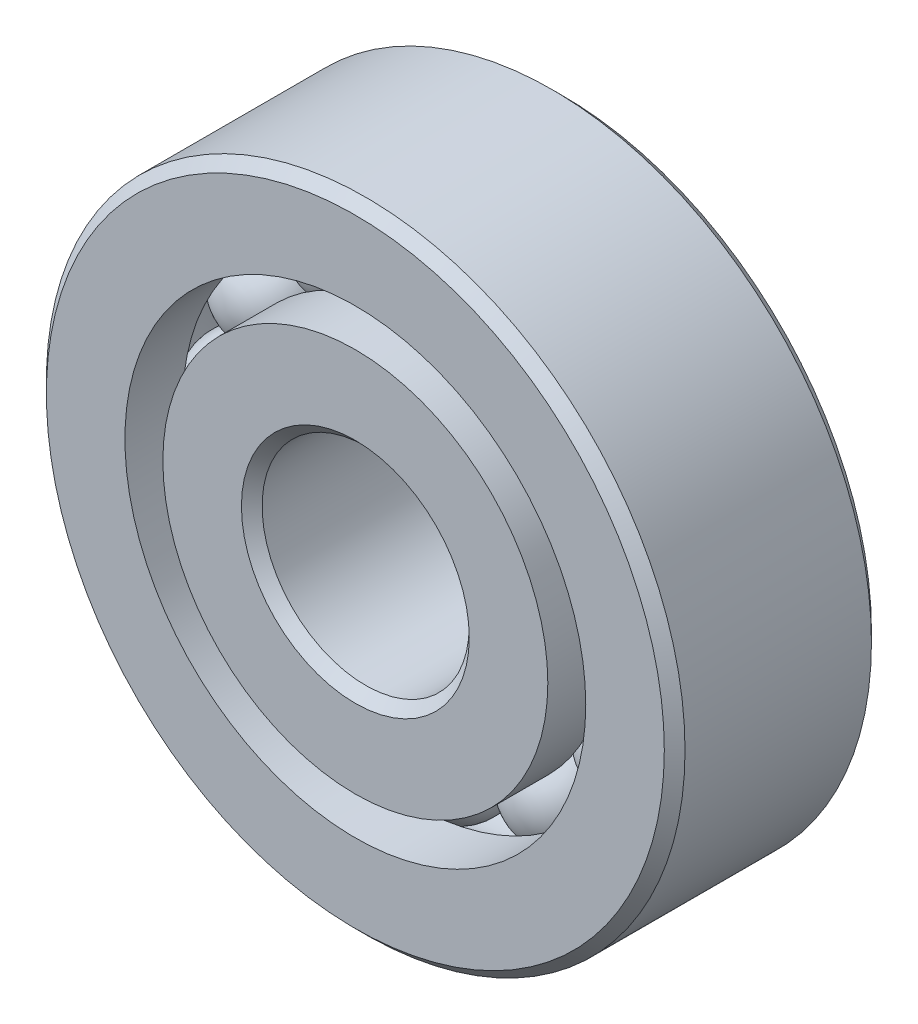
ISO-10303-21;
HEADER;
FILE_DESCRIPTION(('STEP AP214'),'2;1');
FILE_NAME('part.step','',(''),(''),'','','');
FILE_SCHEMA(('AUTOMOTIVE_DESIGN { 1 0 10303 214 1 1 1 1 }'));
ENDSEC;
DATA;
#1=APPLICATION_CONTEXT('core data for automotive mechanical design processes');
#2=APPLICATION_PROTOCOL_DEFINITION('international standard','automotive_design',2000,#1);
#3=PRODUCT_CONTEXT('',#1,'mechanical');
#4=PRODUCT('Part','Part','',(#3));
#5=PRODUCT_RELATED_PRODUCT_CATEGORY('part','',(#4));
#6=PRODUCT_DEFINITION_FORMATION('','',#4);
#7=PRODUCT_DEFINITION_CONTEXT('part definition',#1,'design');
#8=PRODUCT_DEFINITION('design','',#6,#7);
#9=PRODUCT_DEFINITION_SHAPE('','',#8);
#10=(LENGTH_UNIT() NAMED_UNIT(*) SI_UNIT(.MILLI.,.METRE.));
#11=(NAMED_UNIT(*) PLANE_ANGLE_UNIT() SI_UNIT($,.RADIAN.));
#12=(NAMED_UNIT(*) SI_UNIT($,.STERADIAN.) SOLID_ANGLE_UNIT());
#13=UNCERTAINTY_MEASURE_WITH_UNIT(LENGTH_MEASURE(1.E-05),#10,'distance_accuracy_value','');
#14=(GEOMETRIC_REPRESENTATION_CONTEXT(3) GLOBAL_UNCERTAINTY_ASSIGNED_CONTEXT((#13)) GLOBAL_UNIT_ASSIGNED_CONTEXT((#10,
#11,#12)) REPRESENTATION_CONTEXT('',''));
#15=CARTESIAN_POINT('',(0.,0.,0.));
#16=DIRECTION('',(0.,0.,1.));
#17=DIRECTION('',(1.,0.,0.));
#18=AXIS2_PLACEMENT_3D('',#15,#16,#17);
#19=CARTESIAN_POINT('',(-6.12499999999986,10.6088111963595,0.));
#20=DIRECTION('',(0.,0.,1.));
#21=DIRECTION('',(-0.499999999999989,0.866025403784445,0.));
#22=AXIS2_PLACEMENT_3D('',#19,#20,#21);
#23=SPHERICAL_SURFACE('',#22,2.88421475210795);
#24=CARTESIAN_POINT('',(-6.12499999999986,10.6088111963595,2.88421475210795));
#25=VERTEX_POINT('',#24);
#26=VERTEX_LOOP('',#25);
#27=FACE_BOUND('',#26,.T.);
#28=ADVANCED_FACE('F38',(#27),#23,.T.);
#29=CLOSED_SHELL('',(#28));
#30=MANIFOLD_SOLID_BREP('B2',#29);
#31=CARTESIAN_POINT('',(-10.6088111963593,6.12500000000012,0.));
#32=DIRECTION('',(0.,0.,1.));
#33=DIRECTION('',(-0.866025403784433,0.50000000000001,0.));
#34=AXIS2_PLACEMENT_3D('',#31,#32,#33);
#35=SPHERICAL_SURFACE('',#34,2.88421475210795);
#36=CARTESIAN_POINT('',(-10.6088111963593,6.12500000000012,2.88421475210795));
#37=VERTEX_POINT('',#36);
#38=VERTEX_LOOP('',#37);
#39=FACE_BOUND('',#38,.T.);
#40=ADVANCED_FACE('F59',(#39),#35,.T.);
#41=CLOSED_SHELL('',(#40));
#42=MANIFOLD_SOLID_BREP('B6',#41);
#43=CARTESIAN_POINT('',(-12.25,1.28311939202485E-13,0.));
#44=DIRECTION('',(0.,0.,1.));
#45=DIRECTION('',(-1.,0.,0.));
#46=AXIS2_PLACEMENT_3D('',#43,#44,#45);
#47=SPHERICAL_SURFACE('',#46,2.88421475210795);
#48=CARTESIAN_POINT('',(-12.25,1.28311939202485E-13,2.88421475210795));
#49=VERTEX_POINT('',#48);
#50=VERTEX_LOOP('',#49);
#51=FACE_BOUND('',#50,.T.);
#52=ADVANCED_FACE('F80',(#51),#47,.T.);
#53=CLOSED_SHELL('',(#52));
#54=MANIFOLD_SOLID_BREP('B34',#53);
#55=CARTESIAN_POINT('',(-10.6088111963594,-6.1249999999999,0.));
#56=DIRECTION('',(0.,0.,1.));
#57=DIRECTION('',(-0.866025403784443,-0.499999999999992,0.));
#58=AXIS2_PLACEMENT_3D('',#55,#56,#57);
#59=SPHERICAL_SURFACE('',#58,2.88421475210795);
#60=CARTESIAN_POINT('',(-10.6088111963594,-6.1249999999999,2.88421475210795));
#61=VERTEX_POINT('',#60);
#62=VERTEX_LOOP('',#61);
#63=FACE_BOUND('',#62,.T.);
#64=ADVANCED_FACE('F101',(#63),#59,.T.);
#65=CLOSED_SHELL('',(#64));
#66=MANIFOLD_SOLID_BREP('B55',#65);
#67=CARTESIAN_POINT('',(-6.12500000000009,-10.6088111963593,0.));
#68=DIRECTION('',(0.,0.,1.));
#69=DIRECTION('',(-0.500000000000007,-0.866025403784435,0.));
#70=AXIS2_PLACEMENT_3D('',#67,#68,#69);
#71=SPHERICAL_SURFACE('',#70,2.88421475210795);
#72=CARTESIAN_POINT('',(-6.12500000000009,-10.6088111963593,2.88421475210795));
#73=VERTEX_POINT('',#72);
#74=VERTEX_LOOP('',#73);
#75=FACE_BOUND('',#74,.T.);
#76=ADVANCED_FACE('F122',(#75),#71,.T.);
#77=CLOSED_SHELL('',(#76));
#78=MANIFOLD_SOLID_BREP('B76',#77);
#79=CARTESIAN_POINT('',(0.,-12.25,0.));
#80=DIRECTION('',(0.,0.,1.));
#81=DIRECTION('',(0.,-1.,0.));
#82=AXIS2_PLACEMENT_3D('',#79,#80,#81);
#83=SPHERICAL_SURFACE('',#82,2.88421475210795);
#84=CARTESIAN_POINT('',(0.,-12.25,2.88421475210795));
#85=VERTEX_POINT('',#84);
#86=VERTEX_LOOP('',#85);
#87=FACE_BOUND('',#86,.T.);
#88=ADVANCED_FACE('F143',(#87),#83,.T.);
#89=CLOSED_SHELL('',(#88));
#90=MANIFOLD_SOLID_BREP('B97',#89);
#91=CARTESIAN_POINT('',(6.12499999999994,-10.6088111963594,0.));
#92=DIRECTION('',(0.,0.,1.));
#93=DIRECTION('',(0.499999999999995,-0.866025403784442,0.));
#94=AXIS2_PLACEMENT_3D('',#91,#92,#93);
#95=SPHERICAL_SURFACE('',#94,2.88421475210795);
#96=CARTESIAN_POINT('',(6.12499999999994,-10.6088111963594,2.88421475210795));
#97=VERTEX_POINT('',#96);
#98=VERTEX_LOOP('',#97);
#99=FACE_BOUND('',#98,.T.);
#100=ADVANCED_FACE('F164',(#99),#95,.T.);
#101=CLOSED_SHELL('',(#100));
#102=MANIFOLD_SOLID_BREP('B118',#101);
#103=CARTESIAN_POINT('',(10.6088111963593,-6.12500000000005,0.));
#104=DIRECTION('',(0.,0.,1.));
#105=DIRECTION('',(0.866025403784436,-0.500000000000004,0.));
#106=AXIS2_PLACEMENT_3D('',#103,#104,#105);
#107=SPHERICAL_SURFACE('',#106,2.88421475210795);
#108=CARTESIAN_POINT('',(10.6088111963593,-6.12500000000005,2.88421475210795));
#109=VERTEX_POINT('',#108);
#110=VERTEX_LOOP('',#109);
#111=FACE_BOUND('',#110,.T.);
#112=ADVANCED_FACE('F185',(#111),#107,.T.);
#113=CLOSED_SHELL('',(#112));
#114=MANIFOLD_SOLID_BREP('B139',#113);
#115=CARTESIAN_POINT('',(12.25,0.,0.));
#116=DIRECTION('',(0.,0.,1.));
#117=DIRECTION('',(1.,0.,0.));
#118=AXIS2_PLACEMENT_3D('',#115,#116,#117);
#119=SPHERICAL_SURFACE('',#118,2.88421475210795);
#120=CARTESIAN_POINT('',(12.25,0.,2.88421475210795));
#121=VERTEX_POINT('',#120);
#122=VERTEX_LOOP('',#121);
#123=FACE_BOUND('',#122,.T.);
#124=ADVANCED_FACE('F206',(#123),#119,.T.);
#125=CLOSED_SHELL('',(#124));
#126=MANIFOLD_SOLID_BREP('B160',#125);
#127=CARTESIAN_POINT('',(10.6088111963594,6.12499999999998,0.));
#128=DIRECTION('',(0.,0.,1.));
#129=DIRECTION('',(0.86602540378444,0.499999999999998,0.));
#130=AXIS2_PLACEMENT_3D('',#127,#128,#129);
#131=SPHERICAL_SURFACE('',#130,2.88421475210795);
#132=CARTESIAN_POINT('',(10.6088111963594,6.12499999999998,2.88421475210795));
#133=VERTEX_POINT('',#132);
#134=VERTEX_LOOP('',#133);
#135=FACE_BOUND('',#134,.T.);
#136=ADVANCED_FACE('F227',(#135),#131,.T.);
#137=CLOSED_SHELL('',(#136));
#138=MANIFOLD_SOLID_BREP('B181',#137);
#139=CARTESIAN_POINT('',(6.12500000000001,10.6088111963594,0.));
#140=DIRECTION('',(0.,0.,1.));
#141=DIRECTION('',(0.500000000000001,0.866025403784438,0.));
#142=AXIS2_PLACEMENT_3D('',#139,#140,#141);
#143=SPHERICAL_SURFACE('',#142,2.88421475210795);
#144=CARTESIAN_POINT('',(6.12500000000001,10.6088111963594,2.88421475210795));
#145=VERTEX_POINT('',#144);
#146=VERTEX_LOOP('',#145);
#147=FACE_BOUND('',#146,.T.);
#148=ADVANCED_FACE('F248',(#147),#143,.T.);
#149=CLOSED_SHELL('',(#148));
#150=MANIFOLD_SOLID_BREP('B202',#149);
#151=CARTESIAN_POINT('',(0.,12.25,0.));
#152=DIRECTION('',(0.,0.,1.));
#153=DIRECTION('',(0.,1.,0.));
#154=AXIS2_PLACEMENT_3D('',#151,#152,#153);
#155=SPHERICAL_SURFACE('',#154,2.88421475210795);
#156=CARTESIAN_POINT('',(0.,12.25,2.88421475210795));
#157=VERTEX_POINT('',#156);
#158=VERTEX_LOOP('',#157);
#159=FACE_BOUND('',#158,.T.);
#160=ADVANCED_FACE('F271',(#159),#155,.T.);
#161=CLOSED_SHELL('',(#160));
#162=MANIFOLD_SOLID_BREP('B223',#161);
#163=CARTESIAN_POINT('',(0.,11.1510989010989,6.));
#164=DIRECTION('',(0.,0.,-1.));
#165=DIRECTION('',(-1.,0.,0.));
#166=AXIS2_PLACEMENT_3D('',#163,#164,#165);
#167=PLANE('',#166);
#168=CARTESIAN_POINT('',(0.,0.,6.));
#169=DIRECTION('',(0.,0.,1.));
#170=DIRECTION('',(1.,0.,0.));
#171=AXIS2_PLACEMENT_3D('',#168,#169,#170);
#172=CIRCLE('',#171,6.6);
#173=CARTESIAN_POINT('',(6.6,0.,6.));
#174=VERTEX_POINT('',#173);
#175=EDGE_CURVE('E319',#174,#174,#172,.T.);
#176=ORIENTED_EDGE('',*,*,#175,.F.);
#177=EDGE_LOOP('',(#176));
#178=FACE_BOUND('',#177,.T.);
#179=CARTESIAN_POINT('',(0.,0.,6.));
#180=DIRECTION('',(0.,0.,1.));
#181=DIRECTION('',(1.,0.,0.));
#182=AXIS2_PLACEMENT_3D('',#179,#180,#181);
#183=CIRCLE('',#182,11.1510989010989);
#184=CARTESIAN_POINT('',(11.1510989010989,0.,6.));
#185=VERTEX_POINT('',#184);
#186=EDGE_CURVE('E270',#185,#185,#183,.T.);
#187=ORIENTED_EDGE('',*,*,#186,.T.);
#188=EDGE_LOOP('',(#187));
#189=FACE_BOUND('',#188,.T.);
#190=ADVANCED_FACE('F291',(#178,#189),#167,.F.);
#191=CARTESIAN_POINT('',(0.,0.,6.));
#192=DIRECTION('',(0.,0.,1.));
#193=DIRECTION('',(1.,0.,0.));
#194=AXIS2_PLACEMENT_3D('',#191,#192,#193);
#195=CYLINDRICAL_SURFACE('',#194,11.1510989010989);
#196=ORIENTED_EDGE('',*,*,#186,.F.);
#197=EDGE_LOOP('',(#196));
#198=FACE_BOUND('',#197,.T.);
#199=CARTESIAN_POINT('',(0.,0.,2.66666666666667));
#200=DIRECTION('',(0.,0.,1.));
#201=DIRECTION('',(1.,0.,0.));
#202=AXIS2_PLACEMENT_3D('',#199,#200,#201);
#203=CIRCLE('',#202,11.1510989010989);
#204=CARTESIAN_POINT('',(11.1510989010989,0.,2.66666666666667));
#205=VERTEX_POINT('',#204);
#206=EDGE_CURVE('E297',#205,#205,#203,.T.);
#207=ORIENTED_EDGE('',*,*,#206,.T.);
#208=EDGE_LOOP('',(#207));
#209=FACE_BOUND('',#208,.T.);
#210=ADVANCED_FACE('F326',(#198,#209),#195,.T.);
#211=CARTESIAN_POINT('',(0.,0.,0.));
#212=DIRECTION('',(0.,0.,1.));
#213=DIRECTION('',(1.,0.,0.));
#214=AXIS2_PLACEMENT_3D('',#211,#212,#213);
#215=TOROIDAL_SURFACE('',#214,12.25,2.88421475210795);
#216=ORIENTED_EDGE('',*,*,#206,.F.);
#217=EDGE_LOOP('',(#216));
#218=FACE_BOUND('',#217,.T.);
#219=CARTESIAN_POINT('',(0.,0.,-2.66666666666667));
#220=DIRECTION('',(0.,0.,1.));
#221=DIRECTION('',(1.,0.,0.));
#222=AXIS2_PLACEMENT_3D('',#219,#220,#221);
#223=CIRCLE('',#222,11.1510989010989);
#224=CARTESIAN_POINT('',(11.1510989010989,0.,-2.66666666666667));
#225=VERTEX_POINT('',#224);
#226=EDGE_CURVE('E301',#225,#225,#223,.T.);
#227=ORIENTED_EDGE('',*,*,#226,.T.);
#228=EDGE_LOOP('',(#227));
#229=FACE_BOUND('',#228,.T.);
#230=ADVANCED_FACE('F330',(#218,#229),#215,.F.);
#231=CARTESIAN_POINT('',(0.,0.,6.));
#232=DIRECTION('',(0.,0.,1.));
#233=DIRECTION('',(1.,0.,0.));
#234=AXIS2_PLACEMENT_3D('',#231,#232,#233);
#235=CYLINDRICAL_SURFACE('',#234,11.1510989010989);
#236=ORIENTED_EDGE('',*,*,#226,.F.);
#237=EDGE_LOOP('',(#236));
#238=FACE_BOUND('',#237,.T.);
#239=CARTESIAN_POINT('',(0.,0.,-6.));
#240=DIRECTION('',(0.,0.,1.));
#241=DIRECTION('',(1.,0.,0.));
#242=AXIS2_PLACEMENT_3D('',#239,#240,#241);
#243=CIRCLE('',#242,11.1510989010989);
#244=CARTESIAN_POINT('',(11.1510989010989,0.,-6.));
#245=VERTEX_POINT('',#244);
#246=EDGE_CURVE('E305',#245,#245,#243,.T.);
#247=ORIENTED_EDGE('',*,*,#246,.T.);
#248=EDGE_LOOP('',(#247));
#249=FACE_BOUND('',#248,.T.);
#250=ADVANCED_FACE('F335',(#238,#249),#235,.T.);
#251=CARTESIAN_POINT('',(0.,6.59999999999999,-6.));
#252=DIRECTION('',(0.,0.,1.));
#253=DIRECTION('',(1.,0.,0.));
#254=AXIS2_PLACEMENT_3D('',#251,#252,#253);
#255=PLANE('',#254);
#256=ORIENTED_EDGE('',*,*,#246,.F.);
#257=EDGE_LOOP('',(#256));
#258=FACE_BOUND('',#257,.T.);
#259=CARTESIAN_POINT('',(0.,0.,-6.));
#260=DIRECTION('',(0.,0.,1.));
#261=DIRECTION('',(1.,0.,0.));
#262=AXIS2_PLACEMENT_3D('',#259,#260,#261);
#263=CIRCLE('',#262,6.59999999999999);
#264=CARTESIAN_POINT('',(6.59999999999999,0.,-6.));
#265=VERTEX_POINT('',#264);
#266=EDGE_CURVE('E310',#265,#265,#263,.T.);
#267=ORIENTED_EDGE('',*,*,#266,.T.);
#268=EDGE_LOOP('',(#267));
#269=FACE_BOUND('',#268,.T.);
#270=ADVANCED_FACE('F341',(#258,#269),#255,.F.);
#271=CARTESIAN_POINT('',(0.,0.,-5.4));
#272=DIRECTION('',(0.,0.,-1.));
#273=DIRECTION('',(-1.,0.,0.));
#274=AXIS2_PLACEMENT_3D('',#271,#272,#273);
#275=CONICAL_SURFACE('',#274,6.,0.785398163397443);
#276=ORIENTED_EDGE('',*,*,#266,.F.);
#277=EDGE_LOOP('',(#276));
#278=FACE_BOUND('',#277,.T.);
#279=CARTESIAN_POINT('',(0.,0.,-5.4));
#280=DIRECTION('',(0.,0.,1.));
#281=DIRECTION('',(1.,0.,0.));
#282=AXIS2_PLACEMENT_3D('',#279,#280,#281);
#283=CIRCLE('',#282,6.);
#284=CARTESIAN_POINT('',(6.,0.,-5.4));
#285=VERTEX_POINT('',#284);
#286=EDGE_CURVE('E313',#285,#285,#283,.T.);
#287=ORIENTED_EDGE('',*,*,#286,.T.);
#288=EDGE_LOOP('',(#287));
#289=FACE_BOUND('',#288,.T.);
#290=ADVANCED_FACE('F345',(#278,#289),#275,.F.);
#291=CARTESIAN_POINT('',(0.,0.,6.));
#292=DIRECTION('',(0.,0.,1.));
#293=DIRECTION('',(1.,0.,0.));
#294=AXIS2_PLACEMENT_3D('',#291,#292,#293);
#295=CYLINDRICAL_SURFACE('',#294,6.);
#296=ORIENTED_EDGE('',*,*,#286,.F.);
#297=EDGE_LOOP('',(#296));
#298=FACE_BOUND('',#297,.T.);
#299=CARTESIAN_POINT('',(0.,0.,5.40000000000001));
#300=DIRECTION('',(0.,0.,1.));
#301=DIRECTION('',(1.,0.,0.));
#302=AXIS2_PLACEMENT_3D('',#299,#300,#301);
#303=CIRCLE('',#302,6.);
#304=CARTESIAN_POINT('',(6.,0.,5.40000000000001));
#305=VERTEX_POINT('',#304);
#306=EDGE_CURVE('E316',#305,#305,#303,.T.);
#307=ORIENTED_EDGE('',*,*,#306,.T.);
#308=EDGE_LOOP('',(#307));
#309=FACE_BOUND('',#308,.T.);
#310=ADVANCED_FACE('F349',(#298,#309),#295,.F.);
#311=CARTESIAN_POINT('',(0.,0.,6.));
#312=DIRECTION('',(0.,0.,1.));
#313=DIRECTION('',(1.,0.,0.));
#314=AXIS2_PLACEMENT_3D('',#311,#312,#313);
#315=CONICAL_SURFACE('',#314,6.6,0.785398163397456);
#316=ORIENTED_EDGE('',*,*,#306,.F.);
#317=EDGE_LOOP('',(#316));
#318=FACE_BOUND('',#317,.T.);
#319=ORIENTED_EDGE('',*,*,#175,.T.);
#320=EDGE_LOOP('',(#319));
#321=FACE_BOUND('',#320,.T.);
#322=ADVANCED_FACE('F323',(#318,#321),#315,.F.);
#323=CLOSED_SHELL('',(#190,#210,#230,#250,#270,#290,#310,#322));
#324=MANIFOLD_SOLID_BREP('B244',#323);
#325=CARTESIAN_POINT('',(0.,0.,5.4));
#326=DIRECTION('',(0.,0.,-1.));
#327=DIRECTION('',(-1.,0.,0.));
#328=AXIS2_PLACEMENT_3D('',#325,#326,#327);
#329=CONICAL_SURFACE('',#328,18.5,0.785398163397445);
#330=CARTESIAN_POINT('',(0.,0.,6.));
#331=DIRECTION('',(0.,0.,1.));
#332=DIRECTION('',(1.,0.,0.));
#333=AXIS2_PLACEMENT_3D('',#330,#331,#332);
#334=CIRCLE('',#333,17.9);
#335=CARTESIAN_POINT('',(17.9,0.,6.));
#336=VERTEX_POINT('',#335);
#337=EDGE_CURVE('E441',#336,#336,#334,.T.);
#338=ORIENTED_EDGE('',*,*,#337,.F.);
#339=EDGE_LOOP('',(#338));
#340=FACE_BOUND('',#339,.T.);
#341=CARTESIAN_POINT('',(0.,0.,5.4));
#342=DIRECTION('',(0.,0.,1.));
#343=DIRECTION('',(1.,0.,0.));
#344=AXIS2_PLACEMENT_3D('',#341,#342,#343);
#345=CIRCLE('',#344,18.5);
#346=CARTESIAN_POINT('',(18.5,0.,5.4));
#347=VERTEX_POINT('',#346);
#348=EDGE_CURVE('E290',#347,#347,#345,.T.);
#349=ORIENTED_EDGE('',*,*,#348,.T.);
#350=EDGE_LOOP('',(#349));
#351=FACE_BOUND('',#350,.T.);
#352=ADVANCED_FACE('F413',(#340,#351),#329,.T.);
#353=CARTESIAN_POINT('',(0.,0.,6.));
#354=DIRECTION('',(0.,0.,1.));
#355=DIRECTION('',(1.,0.,0.));
#356=AXIS2_PLACEMENT_3D('',#353,#354,#355);
#357=CYLINDRICAL_SURFACE('',#356,18.5);
#358=ORIENTED_EDGE('',*,*,#348,.F.);
#359=EDGE_LOOP('',(#358));
#360=FACE_BOUND('',#359,.T.);
#361=CARTESIAN_POINT('',(0.,0.,-5.4));
#362=DIRECTION('',(0.,0.,1.));
#363=DIRECTION('',(1.,0.,0.));
#364=AXIS2_PLACEMENT_3D('',#361,#362,#363);
#365=CIRCLE('',#364,18.5);
#366=CARTESIAN_POINT('',(18.5,0.,-5.4));
#367=VERTEX_POINT('',#366);
#368=EDGE_CURVE('E419',#367,#367,#365,.T.);
#369=ORIENTED_EDGE('',*,*,#368,.T.);
#370=EDGE_LOOP('',(#369));
#371=FACE_BOUND('',#370,.T.);
#372=ADVANCED_FACE('F448',(#360,#371),#357,.T.);
#373=CARTESIAN_POINT('',(0.,0.,-6.));
#374=DIRECTION('',(0.,0.,1.));
#375=DIRECTION('',(1.,0.,0.));
#376=AXIS2_PLACEMENT_3D('',#373,#374,#375);
#377=CONICAL_SURFACE('',#376,17.9,0.785398163397445);
#378=ORIENTED_EDGE('',*,*,#368,.F.);
#379=EDGE_LOOP('',(#378));
#380=FACE_BOUND('',#379,.T.);
#381=CARTESIAN_POINT('',(0.,0.,-6.));
#382=DIRECTION('',(0.,0.,1.));
#383=DIRECTION('',(1.,0.,0.));
#384=AXIS2_PLACEMENT_3D('',#381,#382,#383);
#385=CIRCLE('',#384,17.9);
#386=CARTESIAN_POINT('',(17.9,0.,-6.));
#387=VERTEX_POINT('',#386);
#388=EDGE_CURVE('E423',#387,#387,#385,.T.);
#389=ORIENTED_EDGE('',*,*,#388,.T.);
#390=EDGE_LOOP('',(#389));
#391=FACE_BOUND('',#390,.T.);
#392=ADVANCED_FACE('F452',(#380,#391),#377,.T.);
#393=CARTESIAN_POINT('',(0.,17.9,-6.));
#394=DIRECTION('',(0.,0.,1.));
#395=DIRECTION('',(1.,0.,0.));
#396=AXIS2_PLACEMENT_3D('',#393,#394,#395);
#397=PLANE('',#396);
#398=ORIENTED_EDGE('',*,*,#388,.F.);
#399=EDGE_LOOP('',(#398));
#400=FACE_BOUND('',#399,.T.);
#401=CARTESIAN_POINT('',(0.,0.,-6.));
#402=DIRECTION('',(0.,0.,1.));
#403=DIRECTION('',(1.,0.,0.));
#404=AXIS2_PLACEMENT_3D('',#401,#402,#403);
#405=CIRCLE('',#404,13.3489010989011);
#406=CARTESIAN_POINT('',(13.3489010989011,0.,-6.));
#407=VERTEX_POINT('',#406);
#408=EDGE_CURVE('E427',#407,#407,#405,.T.);
#409=ORIENTED_EDGE('',*,*,#408,.T.);
#410=EDGE_LOOP('',(#409));
#411=FACE_BOUND('',#410,.T.);
#412=ADVANCED_FACE('F457',(#400,#411),#397,.F.);
#413=CARTESIAN_POINT('',(0.,0.,6.));
#414=DIRECTION('',(0.,0.,1.));
#415=DIRECTION('',(1.,0.,0.));
#416=AXIS2_PLACEMENT_3D('',#413,#414,#415);
#417=CYLINDRICAL_SURFACE('',#416,13.3489010989011);
#418=ORIENTED_EDGE('',*,*,#408,.F.);
#419=EDGE_LOOP('',(#418));
#420=FACE_BOUND('',#419,.T.);
#421=CARTESIAN_POINT('',(0.,0.,-2.66666666666667));
#422=DIRECTION('',(0.,0.,1.));
#423=DIRECTION('',(1.,0.,0.));
#424=AXIS2_PLACEMENT_3D('',#421,#422,#423);
#425=CIRCLE('',#424,13.3489010989011);
#426=CARTESIAN_POINT('',(13.3489010989011,0.,-2.66666666666667));
#427=VERTEX_POINT('',#426);
#428=EDGE_CURVE('E432',#427,#427,#425,.T.);
#429=ORIENTED_EDGE('',*,*,#428,.T.);
#430=EDGE_LOOP('',(#429));
#431=FACE_BOUND('',#430,.T.);
#432=ADVANCED_FACE('F463',(#420,#431),#417,.F.);
#433=CARTESIAN_POINT('',(0.,0.,0.));
#434=DIRECTION('',(0.,0.,1.));
#435=DIRECTION('',(1.,0.,0.));
#436=AXIS2_PLACEMENT_3D('',#433,#434,#435);
#437=TOROIDAL_SURFACE('',#436,12.25,2.88421475210795);
#438=ORIENTED_EDGE('',*,*,#428,.F.);
#439=EDGE_LOOP('',(#438));
#440=FACE_BOUND('',#439,.T.);
#441=CARTESIAN_POINT('',(0.,0.,2.66666666666667));
#442=DIRECTION('',(0.,0.,1.));
#443=DIRECTION('',(1.,0.,0.));
#444=AXIS2_PLACEMENT_3D('',#441,#442,#443);
#445=CIRCLE('',#444,13.3489010989011);
#446=CARTESIAN_POINT('',(13.3489010989011,0.,2.66666666666667));
#447=VERTEX_POINT('',#446);
#448=EDGE_CURVE('E435',#447,#447,#445,.T.);
#449=ORIENTED_EDGE('',*,*,#448,.T.);
#450=EDGE_LOOP('',(#449));
#451=FACE_BOUND('',#450,.T.);
#452=ADVANCED_FACE('F467',(#440,#451),#437,.F.);
#453=CARTESIAN_POINT('',(0.,0.,6.));
#454=DIRECTION('',(0.,0.,1.));
#455=DIRECTION('',(1.,0.,0.));
#456=AXIS2_PLACEMENT_3D('',#453,#454,#455);
#457=CYLINDRICAL_SURFACE('',#456,13.3489010989011);
#458=ORIENTED_EDGE('',*,*,#448,.F.);
#459=EDGE_LOOP('',(#458));
#460=FACE_BOUND('',#459,.T.);
#461=CARTESIAN_POINT('',(0.,0.,6.));
#462=DIRECTION('',(0.,0.,1.));
#463=DIRECTION('',(1.,0.,0.));
#464=AXIS2_PLACEMENT_3D('',#461,#462,#463);
#465=CIRCLE('',#464,13.3489010989011);
#466=CARTESIAN_POINT('',(13.3489010989011,0.,6.));
#467=VERTEX_POINT('',#466);
#468=EDGE_CURVE('E438',#467,#467,#465,.T.);
#469=ORIENTED_EDGE('',*,*,#468,.T.);
#470=EDGE_LOOP('',(#469));
#471=FACE_BOUND('',#470,.T.);
#472=ADVANCED_FACE('F471',(#460,#471),#457,.F.);
#473=CARTESIAN_POINT('',(0.,17.9,6.));
#474=DIRECTION('',(0.,0.,-1.));
#475=DIRECTION('',(-1.,0.,0.));
#476=AXIS2_PLACEMENT_3D('',#473,#474,#475);
#477=PLANE('',#476);
#478=ORIENTED_EDGE('',*,*,#468,.F.);
#479=EDGE_LOOP('',(#478));
#480=FACE_BOUND('',#479,.T.);
#481=ORIENTED_EDGE('',*,*,#337,.T.);
#482=EDGE_LOOP('',(#481));
#483=FACE_BOUND('',#482,.T.);
#484=ADVANCED_FACE('F445',(#480,#483),#477,.F.);
#485=CLOSED_SHELL('',(#352,#372,#392,#412,#432,#452,#472,#484));
#486=MANIFOLD_SOLID_BREP('B265',#485);
#487=ADVANCED_BREP_SHAPE_REPRESENTATION('',(#18,#30,#42,#54,#66,#78,#90,#102,#114,#126,#138,
#150,#162,#324,#486),#14);
#488=SHAPE_DEFINITION_REPRESENTATION(#9,#487);
ENDSEC;
END-ISO-10303-21;
